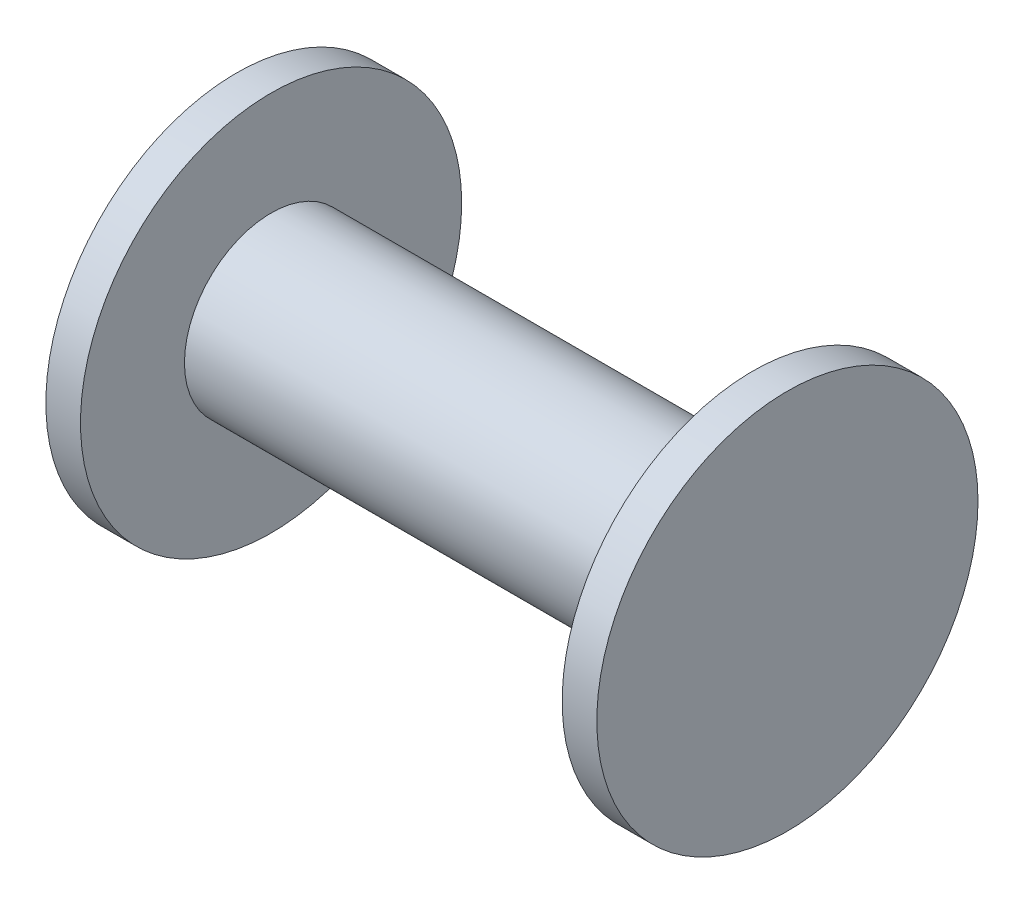
ISO-10303-21;
HEADER;
FILE_DESCRIPTION(('STEP AP214'),'2;1');
FILE_NAME('part.step','',(''),(''),'','','');
FILE_SCHEMA(('AUTOMOTIVE_DESIGN { 1 0 10303 214 1 1 1 1 }'));
ENDSEC;
DATA;
#1=APPLICATION_CONTEXT('core data for automotive mechanical design processes');
#2=APPLICATION_PROTOCOL_DEFINITION('international standard','automotive_design',2000,#1);
#3=PRODUCT_CONTEXT('',#1,'mechanical');
#4=PRODUCT('Part','Part','',(#3));
#5=PRODUCT_RELATED_PRODUCT_CATEGORY('part','',(#4));
#6=PRODUCT_DEFINITION_FORMATION('','',#4);
#7=PRODUCT_DEFINITION_CONTEXT('part definition',#1,'design');
#8=PRODUCT_DEFINITION('design','',#6,#7);
#9=PRODUCT_DEFINITION_SHAPE('','',#8);
#10=(LENGTH_UNIT() NAMED_UNIT(*) SI_UNIT(.MILLI.,.METRE.));
#11=(NAMED_UNIT(*) PLANE_ANGLE_UNIT() SI_UNIT($,.RADIAN.));
#12=(NAMED_UNIT(*) SI_UNIT($,.STERADIAN.) SOLID_ANGLE_UNIT());
#13=UNCERTAINTY_MEASURE_WITH_UNIT(LENGTH_MEASURE(1.E-05),#10,'distance_accuracy_value','');
#14=(GEOMETRIC_REPRESENTATION_CONTEXT(3) GLOBAL_UNCERTAINTY_ASSIGNED_CONTEXT((#13)) GLOBAL_UNIT_ASSIGNED_CONTEXT((#10,
#11,#12)) REPRESENTATION_CONTEXT('',''));
#15=CARTESIAN_POINT('',(0.,0.,0.));
#16=DIRECTION('',(0.,0.,1.));
#17=DIRECTION('',(1.,0.,0.));
#18=AXIS2_PLACEMENT_3D('',#15,#16,#17);
#19=CARTESIAN_POINT('',(15.9,0.,0.));
#20=DIRECTION('',(-1.,0.,0.));
#21=DIRECTION('',(0.,0.,1.));
#22=AXIS2_PLACEMENT_3D('',#19,#20,#21);
#23=CYLINDRICAL_SURFACE('',#22,5.);
#24=CARTESIAN_POINT('',(13.9,0.,0.));
#25=DIRECTION('',(1.,0.,0.));
#26=DIRECTION('',(0.,0.,-1.));
#27=AXIS2_PLACEMENT_3D('',#24,#25,#26);
#28=CIRCLE('',#27,5.);
#29=CARTESIAN_POINT('',(13.9,0.,-5.));
#30=VERTEX_POINT('',#29);
#31=EDGE_CURVE('E38',#30,#30,#28,.T.);
#32=ORIENTED_EDGE('',*,*,#31,.F.);
#33=EDGE_LOOP('',(#32));
#34=FACE_BOUND('',#33,.T.);
#35=CARTESIAN_POINT('',(-13.9,0.,0.));
#36=DIRECTION('',(-1.,0.,0.));
#37=DIRECTION('',(0.,0.,1.));
#38=AXIS2_PLACEMENT_3D('',#35,#36,#37);
#39=CIRCLE('',#38,5.);
#40=CARTESIAN_POINT('',(-13.9,0.,5.));
#41=VERTEX_POINT('',#40);
#42=EDGE_CURVE('E10',#41,#41,#39,.T.);
#43=ORIENTED_EDGE('',*,*,#42,.F.);
#44=EDGE_LOOP('',(#43));
#45=FACE_BOUND('',#44,.T.);
#46=ADVANCED_FACE('F32',(#34,#45),#23,.T.);
#47=CARTESIAN_POINT('',(13.9,0.,0.));
#48=DIRECTION('',(1.,0.,0.));
#49=DIRECTION('',(0.,0.,-1.));
#50=AXIS2_PLACEMENT_3D('',#47,#48,#49);
#51=CYLINDRICAL_SURFACE('',#50,11.);
#52=CARTESIAN_POINT('',(13.9,0.,0.));
#53=DIRECTION('',(1.,0.,0.));
#54=DIRECTION('',(0.,0.,-1.));
#55=AXIS2_PLACEMENT_3D('',#52,#53,#54);
#56=CIRCLE('',#55,11.);
#57=CARTESIAN_POINT('',(13.9,0.,-11.));
#58=VERTEX_POINT('',#57);
#59=EDGE_CURVE('E42',#58,#58,#56,.T.);
#60=ORIENTED_EDGE('',*,*,#59,.T.);
#61=EDGE_LOOP('',(#60));
#62=FACE_BOUND('',#61,.T.);
#63=CARTESIAN_POINT('',(15.9,0.,0.));
#64=DIRECTION('',(1.,0.,0.));
#65=DIRECTION('',(0.,0.,-1.));
#66=AXIS2_PLACEMENT_3D('',#63,#64,#65);
#67=CIRCLE('',#66,11.);
#68=CARTESIAN_POINT('',(15.9,0.,-11.));
#69=VERTEX_POINT('',#68);
#70=EDGE_CURVE('E46',#69,#69,#67,.T.);
#71=ORIENTED_EDGE('',*,*,#70,.F.);
#72=EDGE_LOOP('',(#71));
#73=FACE_BOUND('',#72,.T.);
#74=ADVANCED_FACE('F75',(#62,#73),#51,.T.);
#75=CARTESIAN_POINT('',(13.9,0.,0.));
#76=DIRECTION('',(1.,0.,0.));
#77=DIRECTION('',(0.,0.,-1.));
#78=AXIS2_PLACEMENT_3D('',#75,#76,#77);
#79=PLANE('',#78);
#80=ORIENTED_EDGE('',*,*,#31,.T.);
#81=EDGE_LOOP('',(#80));
#82=FACE_BOUND('',#81,.T.);
#83=ORIENTED_EDGE('',*,*,#59,.F.);
#84=EDGE_LOOP('',(#83));
#85=FACE_BOUND('',#84,.T.);
#86=ADVANCED_FACE('F80',(#82,#85),#79,.F.);
#87=CARTESIAN_POINT('',(15.9,0.,0.));
#88=DIRECTION('',(1.,0.,0.));
#89=DIRECTION('',(0.,0.,-1.));
#90=AXIS2_PLACEMENT_3D('',#87,#88,#89);
#91=PLANE('',#90);
#92=ORIENTED_EDGE('',*,*,#70,.T.);
#93=EDGE_LOOP('',(#92));
#94=FACE_BOUND('',#93,.T.);
#95=ADVANCED_FACE('F63',(#94),#91,.T.);
#96=CARTESIAN_POINT('',(-13.9,0.,0.));
#97=DIRECTION('',(-1.,0.,0.));
#98=DIRECTION('',(0.,0.,1.));
#99=AXIS2_PLACEMENT_3D('',#96,#97,#98);
#100=CYLINDRICAL_SURFACE('',#99,11.);
#101=CARTESIAN_POINT('',(-13.9,0.,0.));
#102=DIRECTION('',(1.,0.,0.));
#103=DIRECTION('',(0.,0.,-1.));
#104=AXIS2_PLACEMENT_3D('',#101,#102,#103);
#105=CIRCLE('',#104,11.);
#106=CARTESIAN_POINT('',(-13.9,0.,-11.));
#107=VERTEX_POINT('',#106);
#108=EDGE_CURVE('E50',#107,#107,#105,.T.);
#109=ORIENTED_EDGE('',*,*,#108,.F.);
#110=EDGE_LOOP('',(#109));
#111=FACE_BOUND('',#110,.T.);
#112=CARTESIAN_POINT('',(-15.9,0.,0.));
#113=DIRECTION('',(1.,0.,0.));
#114=DIRECTION('',(0.,0.,-1.));
#115=AXIS2_PLACEMENT_3D('',#112,#113,#114);
#116=CIRCLE('',#115,11.);
#117=CARTESIAN_POINT('',(-15.9,0.,-11.));
#118=VERTEX_POINT('',#117);
#119=EDGE_CURVE('E52',#118,#118,#116,.T.);
#120=ORIENTED_EDGE('',*,*,#119,.T.);
#121=EDGE_LOOP('',(#120));
#122=FACE_BOUND('',#121,.T.);
#123=ADVANCED_FACE('F60',(#111,#122),#100,.T.);
#124=CARTESIAN_POINT('',(-13.9,0.,0.));
#125=DIRECTION('',(-1.,0.,0.));
#126=DIRECTION('',(0.,0.,-1.));
#127=AXIS2_PLACEMENT_3D('',#124,#125,#126);
#128=PLANE('',#127);
#129=ORIENTED_EDGE('',*,*,#42,.T.);
#130=EDGE_LOOP('',(#129));
#131=FACE_BOUND('',#130,.T.);
#132=ORIENTED_EDGE('',*,*,#108,.T.);
#133=EDGE_LOOP('',(#132));
#134=FACE_BOUND('',#133,.T.);
#135=ADVANCED_FACE('F58',(#131,#134),#128,.F.);
#136=CARTESIAN_POINT('',(-15.9,0.,0.));
#137=DIRECTION('',(1.,0.,0.));
#138=DIRECTION('',(0.,0.,-1.));
#139=AXIS2_PLACEMENT_3D('',#136,#137,#138);
#140=PLANE('',#139);
#141=ORIENTED_EDGE('',*,*,#119,.F.);
#142=EDGE_LOOP('',(#141));
#143=FACE_BOUND('',#142,.T.);
#144=ADVANCED_FACE('F67',(#143),#140,.F.);
#145=CLOSED_SHELL('',(#46,#74,#86,#95,#123,#135,#144));
#146=MANIFOLD_SOLID_BREP('B2',#145);
#147=ADVANCED_BREP_SHAPE_REPRESENTATION('',(#18,#146),#14);
#148=SHAPE_DEFINITION_REPRESENTATION(#9,#147);
ENDSEC;
END-ISO-10303-21;
